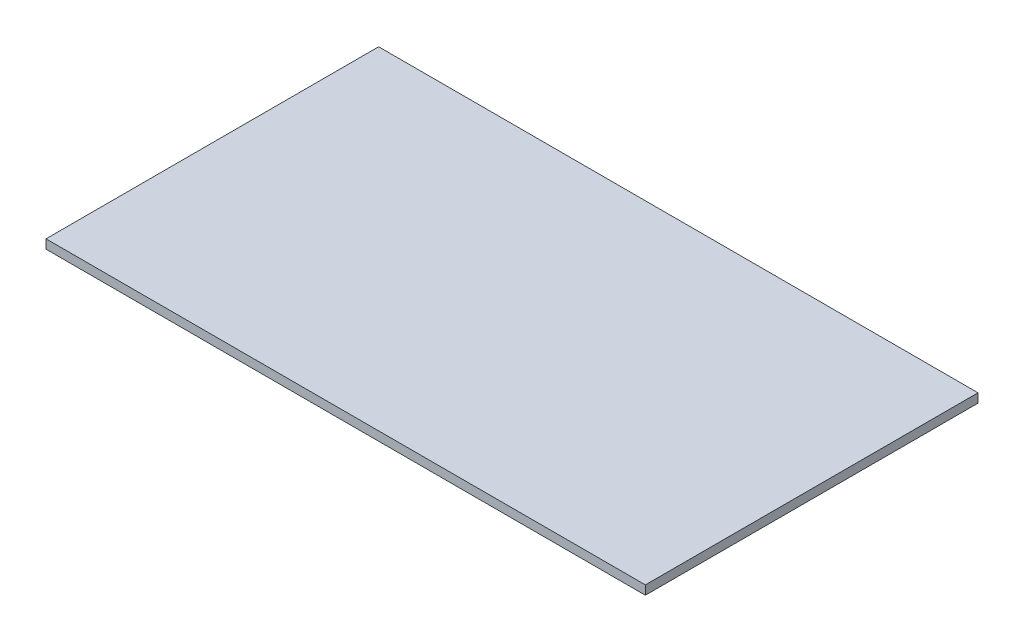
ISO-10303-21;
HEADER;
FILE_DESCRIPTION(('STEP AP214'),'2;1');
FILE_NAME('part.step','',(''),(''),'','','');
FILE_SCHEMA(('AUTOMOTIVE_DESIGN { 1 0 10303 214 1 1 1 1 }'));
ENDSEC;
DATA;
#1=APPLICATION_CONTEXT('core data for automotive mechanical design processes');
#2=APPLICATION_PROTOCOL_DEFINITION('international standard','automotive_design',2000,#1);
#3=PRODUCT_CONTEXT('',#1,'mechanical');
#4=PRODUCT('Part','Part','',(#3));
#5=PRODUCT_RELATED_PRODUCT_CATEGORY('part','',(#4));
#6=PRODUCT_DEFINITION_FORMATION('','',#4);
#7=PRODUCT_DEFINITION_CONTEXT('part definition',#1,'design');
#8=PRODUCT_DEFINITION('design','',#6,#7);
#9=PRODUCT_DEFINITION_SHAPE('','',#8);
#10=(LENGTH_UNIT() NAMED_UNIT(*) SI_UNIT(.MILLI.,.METRE.));
#11=(NAMED_UNIT(*) PLANE_ANGLE_UNIT() SI_UNIT($,.RADIAN.));
#12=(NAMED_UNIT(*) SI_UNIT($,.STERADIAN.) SOLID_ANGLE_UNIT());
#13=UNCERTAINTY_MEASURE_WITH_UNIT(LENGTH_MEASURE(1.E-05),#10,'distance_accuracy_value','');
#14=(GEOMETRIC_REPRESENTATION_CONTEXT(3) GLOBAL_UNCERTAINTY_ASSIGNED_CONTEXT((#13)) GLOBAL_UNIT_ASSIGNED_CONTEXT((#10,
#11,#12)) REPRESENTATION_CONTEXT('',''));
#15=CARTESIAN_POINT('',(0.,0.,0.));
#16=DIRECTION('',(0.,0.,1.));
#17=DIRECTION('',(1.,0.,0.));
#18=AXIS2_PLACEMENT_3D('',#15,#16,#17);
#19=CARTESIAN_POINT('',(0.,6.,0.));
#20=DIRECTION('',(1.,0.,0.));
#21=DIRECTION('',(0.,0.,-1.));
#22=AXIS2_PLACEMENT_3D('',#19,#20,#21);
#23=PLANE('',#22);
#24=DIRECTION('',(0.,0.,1.));
#25=VECTOR('',#24,1.);
#26=CARTESIAN_POINT('',(0.,0.,0.));
#27=LINE('',#26,#25);
#28=CARTESIAN_POINT('',(0.,0.,-222.));
#29=VERTEX_POINT('',#28);
#30=CARTESIAN_POINT('',(0.,0.,0.));
#31=VERTEX_POINT('',#30);
#32=EDGE_CURVE('E99',#29,#31,#27,.T.);
#33=ORIENTED_EDGE('',*,*,#32,.T.);
#34=DIRECTION('',(0.,-1.,0.));
#35=VECTOR('',#34,1.);
#36=CARTESIAN_POINT('',(0.,6.,0.));
#37=LINE('',#36,#35);
#38=CARTESIAN_POINT('',(0.,6.,0.));
#39=VERTEX_POINT('',#38);
#40=EDGE_CURVE('E11',#39,#31,#37,.T.);
#41=ORIENTED_EDGE('',*,*,#40,.F.);
#42=DIRECTION('',(0.,0.,1.));
#43=VECTOR('',#42,1.);
#44=CARTESIAN_POINT('',(0.,6.,0.));
#45=LINE('',#44,#43);
#46=CARTESIAN_POINT('',(0.,6.,-222.));
#47=VERTEX_POINT('',#46);
#48=EDGE_CURVE('E87',#47,#39,#45,.T.);
#49=ORIENTED_EDGE('',*,*,#48,.F.);
#50=DIRECTION('',(0.,-1.,0.));
#51=VECTOR('',#50,1.);
#52=CARTESIAN_POINT('',(0.,6.,-222.));
#53=LINE('',#52,#51);
#54=EDGE_CURVE('E95',#47,#29,#53,.T.);
#55=ORIENTED_EDGE('',*,*,#54,.T.);
#56=EDGE_LOOP('',(#33,#41,#49,#55));
#57=FACE_BOUND('',#56,.T.);
#58=ADVANCED_FACE('F36',(#57),#23,.F.);
#59=CARTESIAN_POINT('',(0.,6.,0.));
#60=DIRECTION('',(0.,0.,-1.));
#61=DIRECTION('',(-1.,0.,0.));
#62=AXIS2_PLACEMENT_3D('',#59,#60,#61);
#63=PLANE('',#62);
#64=DIRECTION('',(1.,0.,0.));
#65=VECTOR('',#64,1.);
#66=CARTESIAN_POINT('',(0.,0.,0.));
#67=LINE('',#66,#65);
#68=CARTESIAN_POINT('',(400.,0.,0.));
#69=VERTEX_POINT('',#68);
#70=EDGE_CURVE('E91',#31,#69,#67,.T.);
#71=ORIENTED_EDGE('',*,*,#70,.T.);
#72=DIRECTION('',(0.,-1.,0.));
#73=VECTOR('',#72,1.);
#74=CARTESIAN_POINT('',(400.,6.,0.));
#75=LINE('',#74,#73);
#76=CARTESIAN_POINT('',(400.,6.,0.));
#77=VERTEX_POINT('',#76);
#78=EDGE_CURVE('E44',#77,#69,#75,.T.);
#79=ORIENTED_EDGE('',*,*,#78,.F.);
#80=DIRECTION('',(1.,0.,0.));
#81=VECTOR('',#80,1.);
#82=CARTESIAN_POINT('',(0.,6.,0.));
#83=LINE('',#82,#81);
#84=EDGE_CURVE('E82',#39,#77,#83,.T.);
#85=ORIENTED_EDGE('',*,*,#84,.F.);
#86=ORIENTED_EDGE('',*,*,#40,.T.);
#87=EDGE_LOOP('',(#71,#79,#85,#86));
#88=FACE_BOUND('',#87,.T.);
#89=ADVANCED_FACE('F90',(#88),#63,.F.);
#90=CARTESIAN_POINT('',(400.,6.,0.));
#91=DIRECTION('',(-1.,0.,0.));
#92=DIRECTION('',(0.,0.,1.));
#93=AXIS2_PLACEMENT_3D('',#90,#91,#92);
#94=PLANE('',#93);
#95=DIRECTION('',(0.,0.,-1.));
#96=VECTOR('',#95,1.);
#97=CARTESIAN_POINT('',(400.,0.,0.));
#98=LINE('',#97,#96);
#99=CARTESIAN_POINT('',(400.,0.,-222.));
#100=VERTEX_POINT('',#99);
#101=EDGE_CURVE('E69',#69,#100,#98,.T.);
#102=ORIENTED_EDGE('',*,*,#101,.T.);
#103=DIRECTION('',(0.,-1.,0.));
#104=VECTOR('',#103,1.);
#105=CARTESIAN_POINT('',(400.,6.,-222.));
#106=LINE('',#105,#104);
#107=CARTESIAN_POINT('',(400.,6.,-222.));
#108=VERTEX_POINT('',#107);
#109=EDGE_CURVE('E92',#108,#100,#106,.T.);
#110=ORIENTED_EDGE('',*,*,#109,.F.);
#111=DIRECTION('',(0.,0.,-1.));
#112=VECTOR('',#111,1.);
#113=CARTESIAN_POINT('',(400.,6.,0.));
#114=LINE('',#113,#112);
#115=EDGE_CURVE('E85',#77,#108,#114,.T.);
#116=ORIENTED_EDGE('',*,*,#115,.F.);
#117=ORIENTED_EDGE('',*,*,#78,.T.);
#118=EDGE_LOOP('',(#102,#110,#116,#117));
#119=FACE_BOUND('',#118,.T.);
#120=ADVANCED_FACE('F93',(#119),#94,.F.);
#121=CARTESIAN_POINT('',(0.,6.,-222.));
#122=DIRECTION('',(0.,0.,1.));
#123=DIRECTION('',(1.,0.,0.));
#124=AXIS2_PLACEMENT_3D('',#121,#122,#123);
#125=PLANE('',#124);
#126=DIRECTION('',(-1.,0.,0.));
#127=VECTOR('',#126,1.);
#128=CARTESIAN_POINT('',(0.,0.,-222.));
#129=LINE('',#128,#127);
#130=EDGE_CURVE('E75',#100,#29,#129,.T.);
#131=ORIENTED_EDGE('',*,*,#130,.T.);
#132=ORIENTED_EDGE('',*,*,#54,.F.);
#133=DIRECTION('',(-1.,0.,0.));
#134=VECTOR('',#133,1.);
#135=CARTESIAN_POINT('',(0.,6.,-222.));
#136=LINE('',#135,#134);
#137=EDGE_CURVE('E52',#108,#47,#136,.T.);
#138=ORIENTED_EDGE('',*,*,#137,.F.);
#139=ORIENTED_EDGE('',*,*,#109,.T.);
#140=EDGE_LOOP('',(#131,#132,#138,#139));
#141=FACE_BOUND('',#140,.T.);
#142=ADVANCED_FACE('F106',(#141),#125,.F.);
#143=CARTESIAN_POINT('',(0.,6.,0.));
#144=DIRECTION('',(0.,-1.,0.));
#145=DIRECTION('',(0.,0.,-1.));
#146=AXIS2_PLACEMENT_3D('',#143,#144,#145);
#147=PLANE('',#146);
#148=ORIENTED_EDGE('',*,*,#48,.T.);
#149=ORIENTED_EDGE('',*,*,#84,.T.);
#150=ORIENTED_EDGE('',*,*,#115,.T.);
#151=ORIENTED_EDGE('',*,*,#137,.T.);
#152=EDGE_LOOP('',(#148,#149,#150,#151));
#153=FACE_BOUND('',#152,.T.);
#154=ADVANCED_FACE('F83',(#153),#147,.F.);
#155=CARTESIAN_POINT('',(0.,0.,0.));
#156=DIRECTION('',(0.,-1.,0.));
#157=DIRECTION('',(0.,0.,-1.));
#158=AXIS2_PLACEMENT_3D('',#155,#156,#157);
#159=PLANE('',#158);
#160=ORIENTED_EDGE('',*,*,#32,.F.);
#161=ORIENTED_EDGE('',*,*,#130,.F.);
#162=ORIENTED_EDGE('',*,*,#101,.F.);
#163=ORIENTED_EDGE('',*,*,#70,.F.);
#164=EDGE_LOOP('',(#160,#161,#162,#163));
#165=FACE_BOUND('',#164,.T.);
#166=ADVANCED_FACE('F109',(#165),#159,.T.);
#167=CLOSED_SHELL('',(#58,#89,#120,#142,#154,#166));
#168=MANIFOLD_SOLID_BREP('B2',#167);
#169=ADVANCED_BREP_SHAPE_REPRESENTATION('',(#18,#168),#14);
#170=SHAPE_DEFINITION_REPRESENTATION(#9,#169);
ENDSEC;
END-ISO-10303-21;
